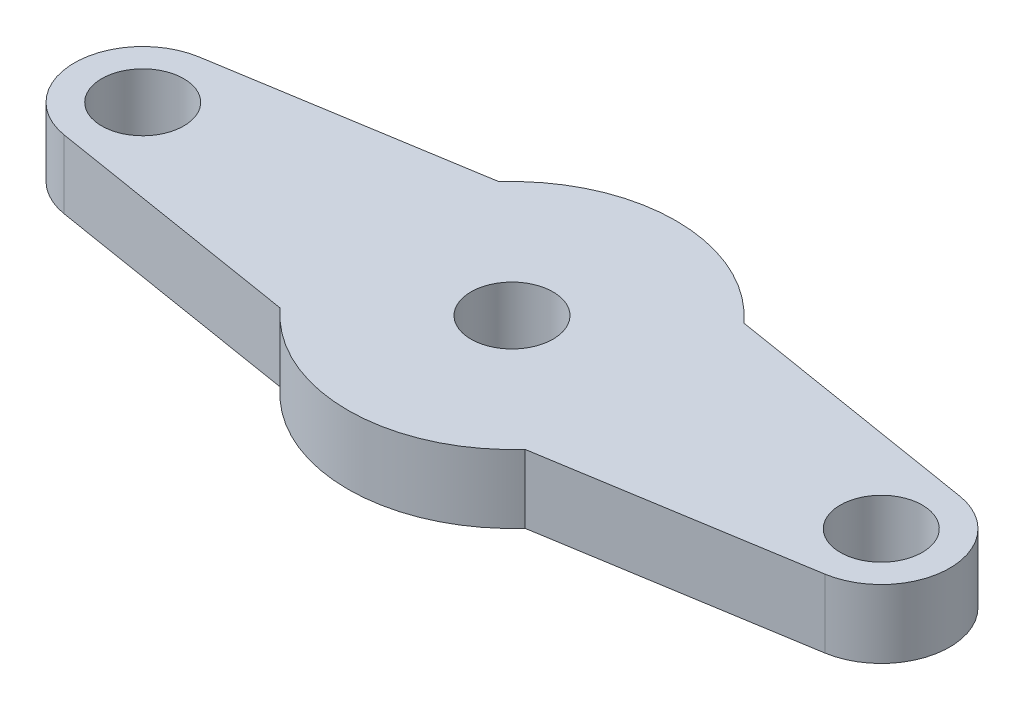
ISO-10303-21;
HEADER;
FILE_DESCRIPTION(('STEP AP214'),'2;1');
FILE_NAME('part.step','',(''),(''),'','','');
FILE_SCHEMA(('AUTOMOTIVE_DESIGN { 1 0 10303 214 1 1 1 1 }'));
ENDSEC;
DATA;
#1=APPLICATION_CONTEXT('core data for automotive mechanical design processes');
#2=APPLICATION_PROTOCOL_DEFINITION('international standard','automotive_design',2000,#1);
#3=PRODUCT_CONTEXT('',#1,'mechanical');
#4=PRODUCT('Part','Part','',(#3));
#5=PRODUCT_RELATED_PRODUCT_CATEGORY('part','',(#4));
#6=PRODUCT_DEFINITION_FORMATION('','',#4);
#7=PRODUCT_DEFINITION_CONTEXT('part definition',#1,'design');
#8=PRODUCT_DEFINITION('design','',#6,#7);
#9=PRODUCT_DEFINITION_SHAPE('','',#8);
#10=(LENGTH_UNIT() NAMED_UNIT(*) SI_UNIT(.MILLI.,.METRE.));
#11=(NAMED_UNIT(*) PLANE_ANGLE_UNIT() SI_UNIT($,.RADIAN.));
#12=(NAMED_UNIT(*) SI_UNIT($,.STERADIAN.) SOLID_ANGLE_UNIT());
#13=UNCERTAINTY_MEASURE_WITH_UNIT(LENGTH_MEASURE(1.E-05),#10,'distance_accuracy_value','');
#14=(GEOMETRIC_REPRESENTATION_CONTEXT(3) GLOBAL_UNCERTAINTY_ASSIGNED_CONTEXT((#13)) GLOBAL_UNIT_ASSIGNED_CONTEXT((#10,
#11,#12)) REPRESENTATION_CONTEXT('',''));
#15=CARTESIAN_POINT('',(0.,0.,0.));
#16=DIRECTION('',(0.,0.,1.));
#17=DIRECTION('',(1.,0.,0.));
#18=AXIS2_PLACEMENT_3D('',#15,#16,#17);
#19=CARTESIAN_POINT('',(0.,0.,0.));
#20=DIRECTION('',(0.,1.,0.));
#21=DIRECTION('',(1.,0.,0.));
#22=AXIS2_PLACEMENT_3D('',#19,#20,#21);
#23=PLANE('',#22);
#24=CARTESIAN_POINT('',(13.5,0.,0.));
#25=DIRECTION('',(0.,1.,0.));
#26=DIRECTION('',(0.,0.,1.));
#27=AXIS2_PLACEMENT_3D('',#24,#25,#26);
#28=CIRCLE('',#27,1.5);
#29=CARTESIAN_POINT('',(13.5,0.,-1.5));
#30=VERTEX_POINT('',#29);
#31=EDGE_CURVE('E185',#30,#30,#28,.T.);
#32=ORIENTED_EDGE('',*,*,#31,.T.);
#33=EDGE_LOOP('',(#32));
#34=FACE_BOUND('',#33,.T.);
#35=CARTESIAN_POINT('',(-13.5,0.,0.));
#36=DIRECTION('',(0.,1.,0.));
#37=DIRECTION('',(0.,0.,1.));
#38=AXIS2_PLACEMENT_3D('',#35,#36,#37);
#39=CIRCLE('',#38,1.5);
#40=CARTESIAN_POINT('',(-13.5,0.,-1.5));
#41=VERTEX_POINT('',#40);
#42=EDGE_CURVE('E141',#41,#41,#39,.T.);
#43=ORIENTED_EDGE('',*,*,#42,.T.);
#44=EDGE_LOOP('',(#43));
#45=FACE_BOUND('',#44,.T.);
#46=CARTESIAN_POINT('',(0.,0.,0.));
#47=DIRECTION('',(0.,1.,0.));
#48=DIRECTION('',(0.,0.,1.));
#49=AXIS2_PLACEMENT_3D('',#46,#47,#48);
#50=CIRCLE('',#49,1.5);
#51=CARTESIAN_POINT('',(0.,0.,1.5));
#52=VERTEX_POINT('',#51);
#53=EDGE_CURVE('E176',#52,#52,#50,.T.);
#54=ORIENTED_EDGE('',*,*,#53,.T.);
#55=EDGE_LOOP('',(#54));
#56=FACE_BOUND('',#55,.T.);
#57=DIRECTION('',(0.987049761955838,0.,-0.160414361647964));
#58=VECTOR('',#57,1.);
#59=CARTESIAN_POINT('',(-0.748428264329384,0.,-4.60517333085503));
#60=LINE('',#59,#58);
#61=CARTESIAN_POINT('',(-13.9010359041199,0.,-2.46762440488959));
#62=VERTEX_POINT('',#61);
#63=CARTESIAN_POINT('',(-4.47213595499958,0.,-4.));
#64=VERTEX_POINT('',#63);
#65=EDGE_CURVE('E74',#62,#64,#60,.T.);
#66=ORIENTED_EDGE('',*,*,#65,.T.);
#67=CARTESIAN_POINT('',(0.,0.,0.));
#68=DIRECTION('',(0.,1.,0.));
#69=DIRECTION('',(0.,0.,1.));
#70=AXIS2_PLACEMENT_3D('',#67,#68,#69);
#71=CIRCLE('',#70,6.);
#72=CARTESIAN_POINT('',(4.47213595499958,0.,-4.));
#73=VERTEX_POINT('',#72);
#74=EDGE_CURVE('E157',#73,#64,#71,.T.);
#75=ORIENTED_EDGE('',*,*,#74,.F.);
#76=DIRECTION('',(-0.987049761955838,0.,-0.160414361647964));
#77=VECTOR('',#76,1.);
#78=CARTESIAN_POINT('',(0.748428264329384,0.,-4.60517333085503));
#79=LINE('',#78,#77);
#80=CARTESIAN_POINT('',(13.9010359041199,0.,-2.4676244048896));
#81=VERTEX_POINT('',#80);
#82=EDGE_CURVE('E28',#81,#73,#79,.T.);
#83=ORIENTED_EDGE('',*,*,#82,.F.);
#84=CARTESIAN_POINT('',(13.5,0.,0.));
#85=DIRECTION('',(0.,1.,0.));
#86=DIRECTION('',(0.,0.,1.));
#87=AXIS2_PLACEMENT_3D('',#84,#85,#86);
#88=CIRCLE('',#87,2.5);
#89=CARTESIAN_POINT('',(13.9010359041199,0.,2.46762440488959));
#90=VERTEX_POINT('',#89);
#91=EDGE_CURVE('E166',#90,#81,#88,.T.);
#92=ORIENTED_EDGE('',*,*,#91,.F.);
#93=DIRECTION('',(-0.987049761955838,0.,0.160414361647964));
#94=VECTOR('',#93,1.);
#95=CARTESIAN_POINT('',(0.748428264329379,0.,4.60517333085502));
#96=LINE('',#95,#94);
#97=CARTESIAN_POINT('',(4.47213595499953,0.,4.));
#98=VERTEX_POINT('',#97);
#99=EDGE_CURVE('E172',#90,#98,#96,.T.);
#100=ORIENTED_EDGE('',*,*,#99,.T.);
#101=CARTESIAN_POINT('',(0.,0.,0.));
#102=DIRECTION('',(0.,1.,0.));
#103=DIRECTION('',(0.,0.,1.));
#104=AXIS2_PLACEMENT_3D('',#101,#102,#103);
#105=CIRCLE('',#104,6.);
#106=CARTESIAN_POINT('',(-4.47213595499954,0.,4.));
#107=VERTEX_POINT('',#106);
#108=EDGE_CURVE('E121',#107,#98,#105,.T.);
#109=ORIENTED_EDGE('',*,*,#108,.F.);
#110=DIRECTION('',(0.987049761955838,0.,0.160414361647964));
#111=VECTOR('',#110,1.);
#112=CARTESIAN_POINT('',(-0.74842826432938,0.,4.60517333085502));
#113=LINE('',#112,#111);
#114=CARTESIAN_POINT('',(-13.9010359041199,0.,2.46762440488959));
#115=VERTEX_POINT('',#114);
#116=EDGE_CURVE('E186',#115,#107,#113,.T.);
#117=ORIENTED_EDGE('',*,*,#116,.F.);
#118=CARTESIAN_POINT('',(-13.5,0.,0.));
#119=DIRECTION('',(0.,1.,0.));
#120=DIRECTION('',(0.,0.,1.));
#121=AXIS2_PLACEMENT_3D('',#118,#119,#120);
#122=CIRCLE('',#121,2.5);
#123=EDGE_CURVE('E214',#62,#115,#122,.T.);
#124=ORIENTED_EDGE('',*,*,#123,.F.);
#125=EDGE_LOOP('',(#66,#75,#83,#92,#100,#109,#117,#124));
#126=FACE_BOUND('',#125,.T.);
#127=ADVANCED_FACE('F17',(#34,#45,#56,#126),#23,.F.);
#128=CARTESIAN_POINT('',(0.,2.5,0.));
#129=DIRECTION('',(0.,1.,0.));
#130=DIRECTION('',(1.,0.,0.));
#131=AXIS2_PLACEMENT_3D('',#128,#129,#130);
#132=PLANE('',#131);
#133=CARTESIAN_POINT('',(13.5,2.5,0.));
#134=DIRECTION('',(0.,1.,0.));
#135=DIRECTION('',(0.,0.,1.));
#136=AXIS2_PLACEMENT_3D('',#133,#134,#135);
#137=CIRCLE('',#136,1.5);
#138=CARTESIAN_POINT('',(13.5,2.5,-1.5));
#139=VERTEX_POINT('',#138);
#140=EDGE_CURVE('E184',#139,#139,#137,.T.);
#141=ORIENTED_EDGE('',*,*,#140,.F.);
#142=EDGE_LOOP('',(#141));
#143=FACE_BOUND('',#142,.T.);
#144=CARTESIAN_POINT('',(-13.5,2.5,0.));
#145=DIRECTION('',(0.,1.,0.));
#146=DIRECTION('',(0.,0.,1.));
#147=AXIS2_PLACEMENT_3D('',#144,#145,#146);
#148=CIRCLE('',#147,1.5);
#149=CARTESIAN_POINT('',(-13.5,2.5,-1.5));
#150=VERTEX_POINT('',#149);
#151=EDGE_CURVE('E143',#150,#150,#148,.T.);
#152=ORIENTED_EDGE('',*,*,#151,.F.);
#153=EDGE_LOOP('',(#152));
#154=FACE_BOUND('',#153,.T.);
#155=CARTESIAN_POINT('',(0.,2.5,0.));
#156=DIRECTION('',(0.,1.,0.));
#157=DIRECTION('',(0.,0.,1.));
#158=AXIS2_PLACEMENT_3D('',#155,#156,#157);
#159=CIRCLE('',#158,1.5);
#160=CARTESIAN_POINT('',(0.,2.5,1.5));
#161=VERTEX_POINT('',#160);
#162=EDGE_CURVE('E234',#161,#161,#159,.T.);
#163=ORIENTED_EDGE('',*,*,#162,.F.);
#164=EDGE_LOOP('',(#163));
#165=FACE_BOUND('',#164,.T.);
#166=DIRECTION('',(0.987049761955838,0.,-0.160414361647964));
#167=VECTOR('',#166,1.);
#168=CARTESIAN_POINT('',(-0.748428264329384,2.5,-4.60517333085503));
#169=LINE('',#168,#167);
#170=CARTESIAN_POINT('',(-13.9010359041199,2.5,-2.46762440488959));
#171=VERTEX_POINT('',#170);
#172=CARTESIAN_POINT('',(-4.47213595499958,2.5,-4.));
#173=VERTEX_POINT('',#172);
#174=EDGE_CURVE('E171',#171,#173,#169,.T.);
#175=ORIENTED_EDGE('',*,*,#174,.F.);
#176=CARTESIAN_POINT('',(-13.5,2.5,0.));
#177=DIRECTION('',(0.,1.,0.));
#178=DIRECTION('',(0.,0.,1.));
#179=AXIS2_PLACEMENT_3D('',#176,#177,#178);
#180=CIRCLE('',#179,2.5);
#181=CARTESIAN_POINT('',(-13.9010359041199,2.5,2.46762440488959));
#182=VERTEX_POINT('',#181);
#183=EDGE_CURVE('E190',#171,#182,#180,.T.);
#184=ORIENTED_EDGE('',*,*,#183,.T.);
#185=DIRECTION('',(0.987049761955838,0.,0.160414361647964));
#186=VECTOR('',#185,1.);
#187=CARTESIAN_POINT('',(-0.74842826432938,2.5,4.60517333085502));
#188=LINE('',#187,#186);
#189=CARTESIAN_POINT('',(-4.47213595499954,2.5,4.));
#190=VERTEX_POINT('',#189);
#191=EDGE_CURVE('E211',#182,#190,#188,.T.);
#192=ORIENTED_EDGE('',*,*,#191,.T.);
#193=CARTESIAN_POINT('',(0.,2.5,0.));
#194=DIRECTION('',(0.,1.,0.));
#195=DIRECTION('',(0.,0.,1.));
#196=AXIS2_PLACEMENT_3D('',#193,#194,#195);
#197=CIRCLE('',#196,6.);
#198=CARTESIAN_POINT('',(4.47213595499953,2.5,4.));
#199=VERTEX_POINT('',#198);
#200=EDGE_CURVE('E108',#190,#199,#197,.T.);
#201=ORIENTED_EDGE('',*,*,#200,.T.);
#202=DIRECTION('',(-0.987049761955838,0.,0.160414361647964));
#203=VECTOR('',#202,1.);
#204=CARTESIAN_POINT('',(0.748428264329379,2.5,4.60517333085502));
#205=LINE('',#204,#203);
#206=CARTESIAN_POINT('',(13.9010359041199,2.5,2.46762440488959));
#207=VERTEX_POINT('',#206);
#208=EDGE_CURVE('E207',#207,#199,#205,.T.);
#209=ORIENTED_EDGE('',*,*,#208,.F.);
#210=CARTESIAN_POINT('',(13.5,2.5,0.));
#211=DIRECTION('',(0.,1.,0.));
#212=DIRECTION('',(0.,0.,1.));
#213=AXIS2_PLACEMENT_3D('',#210,#211,#212);
#214=CIRCLE('',#213,2.5);
#215=CARTESIAN_POINT('',(13.9010359041199,2.5,-2.4676244048896));
#216=VERTEX_POINT('',#215);
#217=EDGE_CURVE('E155',#207,#216,#214,.T.);
#218=ORIENTED_EDGE('',*,*,#217,.T.);
#219=DIRECTION('',(-0.987049761955838,0.,-0.160414361647964));
#220=VECTOR('',#219,1.);
#221=CARTESIAN_POINT('',(0.748428264329384,2.5,-4.60517333085503));
#222=LINE('',#221,#220);
#223=CARTESIAN_POINT('',(4.47213595499958,2.5,-4.));
#224=VERTEX_POINT('',#223);
#225=EDGE_CURVE('E11',#216,#224,#222,.T.);
#226=ORIENTED_EDGE('',*,*,#225,.T.);
#227=CARTESIAN_POINT('',(0.,2.5,0.));
#228=DIRECTION('',(0.,1.,0.));
#229=DIRECTION('',(0.,0.,1.));
#230=AXIS2_PLACEMENT_3D('',#227,#228,#229);
#231=CIRCLE('',#230,6.);
#232=EDGE_CURVE('E21',#224,#173,#231,.T.);
#233=ORIENTED_EDGE('',*,*,#232,.T.);
#234=EDGE_LOOP('',(#175,#184,#192,#201,#209,#218,#226,#233));
#235=FACE_BOUND('',#234,.T.);
#236=ADVANCED_FACE('F270',(#143,#154,#165,#235),#132,.T.);
#237=CARTESIAN_POINT('',(0.748428264329384,2.5,-4.60517333085503));
#238=DIRECTION('',(-0.160414361647964,0.,0.987049761955838));
#239=DIRECTION('',(0.,1.,0.));
#240=AXIS2_PLACEMENT_3D('',#237,#238,#239);
#241=PLANE('',#240);
#242=ORIENTED_EDGE('',*,*,#82,.T.);
#243=DIRECTION('',(0.,-1.,0.));
#244=VECTOR('',#243,1.);
#245=CARTESIAN_POINT('',(4.47213595499958,2.5,-4.));
#246=LINE('',#245,#244);
#247=EDGE_CURVE('E162',#224,#73,#246,.T.);
#248=ORIENTED_EDGE('',*,*,#247,.F.);
#249=ORIENTED_EDGE('',*,*,#225,.F.);
#250=DIRECTION('',(0.,-1.,0.));
#251=VECTOR('',#250,1.);
#252=CARTESIAN_POINT('',(13.9010359041199,2.5,-2.4676244048896));
#253=LINE('',#252,#251);
#254=EDGE_CURVE('E163',#216,#81,#253,.T.);
#255=ORIENTED_EDGE('',*,*,#254,.T.);
#256=EDGE_LOOP('',(#242,#248,#249,#255));
#257=FACE_BOUND('',#256,.T.);
#258=ADVANCED_FACE('F276',(#257),#241,.F.);
#259=CARTESIAN_POINT('',(13.5,2.5,0.));
#260=DIRECTION('',(0.,-1.,0.));
#261=DIRECTION('',(0.,0.,-1.));
#262=AXIS2_PLACEMENT_3D('',#259,#260,#261);
#263=CYLINDRICAL_SURFACE('',#262,2.5);
#264=ORIENTED_EDGE('',*,*,#91,.T.);
#265=ORIENTED_EDGE('',*,*,#254,.F.);
#266=ORIENTED_EDGE('',*,*,#217,.F.);
#267=DIRECTION('',(0.,-1.,0.));
#268=VECTOR('',#267,1.);
#269=CARTESIAN_POINT('',(13.9010359041199,2.5,2.46762440488959));
#270=LINE('',#269,#268);
#271=EDGE_CURVE('E175',#207,#90,#270,.T.);
#272=ORIENTED_EDGE('',*,*,#271,.T.);
#273=EDGE_LOOP('',(#264,#265,#266,#272));
#274=FACE_BOUND('',#273,.T.);
#275=ADVANCED_FACE('F294',(#274),#263,.T.);
#276=CARTESIAN_POINT('',(0.748428264329379,2.5,4.60517333085502));
#277=DIRECTION('',(0.160414361647964,0.,0.987049761955838));
#278=DIRECTION('',(0.,-1.,0.));
#279=AXIS2_PLACEMENT_3D('',#276,#277,#278);
#280=PLANE('',#279);
#281=ORIENTED_EDGE('',*,*,#99,.F.);
#282=ORIENTED_EDGE('',*,*,#271,.F.);
#283=ORIENTED_EDGE('',*,*,#208,.T.);
#284=DIRECTION('',(0.,-1.,0.));
#285=VECTOR('',#284,1.);
#286=CARTESIAN_POINT('',(4.47213595499953,2.5,4.));
#287=LINE('',#286,#285);
#288=EDGE_CURVE('E210',#199,#98,#287,.T.);
#289=ORIENTED_EDGE('',*,*,#288,.T.);
#290=EDGE_LOOP('',(#281,#282,#283,#289));
#291=FACE_BOUND('',#290,.T.);
#292=ADVANCED_FACE('F290',(#291),#280,.T.);
#293=CARTESIAN_POINT('',(0.,2.5,0.));
#294=DIRECTION('',(0.,-1.,0.));
#295=DIRECTION('',(0.,0.,1.));
#296=AXIS2_PLACEMENT_3D('',#293,#294,#295);
#297=CYLINDRICAL_SURFACE('',#296,6.);
#298=ORIENTED_EDGE('',*,*,#108,.T.);
#299=ORIENTED_EDGE('',*,*,#288,.F.);
#300=ORIENTED_EDGE('',*,*,#200,.F.);
#301=DIRECTION('',(0.,-1.,0.));
#302=VECTOR('',#301,1.);
#303=CARTESIAN_POINT('',(-4.47213595499954,2.5,4.));
#304=LINE('',#303,#302);
#305=EDGE_CURVE('E189',#190,#107,#304,.T.);
#306=ORIENTED_EDGE('',*,*,#305,.T.);
#307=EDGE_LOOP('',(#298,#299,#300,#306));
#308=FACE_BOUND('',#307,.T.);
#309=ADVANCED_FACE('F287',(#308),#297,.T.);
#310=CARTESIAN_POINT('',(-0.74842826432938,2.5,4.60517333085502));
#311=DIRECTION('',(0.160414361647964,0.,-0.987049761955838));
#312=DIRECTION('',(0.,-1.,0.));
#313=AXIS2_PLACEMENT_3D('',#310,#311,#312);
#314=PLANE('',#313);
#315=ORIENTED_EDGE('',*,*,#116,.T.);
#316=ORIENTED_EDGE('',*,*,#305,.F.);
#317=ORIENTED_EDGE('',*,*,#191,.F.);
#318=DIRECTION('',(0.,-1.,0.));
#319=VECTOR('',#318,1.);
#320=CARTESIAN_POINT('',(-13.9010359041199,2.5,2.46762440488959));
#321=LINE('',#320,#319);
#322=EDGE_CURVE('E217',#182,#115,#321,.T.);
#323=ORIENTED_EDGE('',*,*,#322,.T.);
#324=EDGE_LOOP('',(#315,#316,#317,#323));
#325=FACE_BOUND('',#324,.T.);
#326=ADVANCED_FACE('F19',(#325),#314,.F.);
#327=CARTESIAN_POINT('',(-13.5,2.5,0.));
#328=DIRECTION('',(0.,-1.,0.));
#329=DIRECTION('',(0.,0.,-1.));
#330=AXIS2_PLACEMENT_3D('',#327,#328,#329);
#331=CYLINDRICAL_SURFACE('',#330,2.5);
#332=ORIENTED_EDGE('',*,*,#123,.T.);
#333=ORIENTED_EDGE('',*,*,#322,.F.);
#334=ORIENTED_EDGE('',*,*,#183,.F.);
#335=DIRECTION('',(0.,-1.,0.));
#336=VECTOR('',#335,1.);
#337=CARTESIAN_POINT('',(-13.9010359041199,2.5,-2.46762440488959));
#338=LINE('',#337,#336);
#339=EDGE_CURVE('E167',#171,#62,#338,.T.);
#340=ORIENTED_EDGE('',*,*,#339,.T.);
#341=EDGE_LOOP('',(#332,#333,#334,#340));
#342=FACE_BOUND('',#341,.T.);
#343=ADVANCED_FACE('F267',(#342),#331,.T.);
#344=CARTESIAN_POINT('',(-0.748428264329384,2.5,-4.60517333085503));
#345=DIRECTION('',(-0.160414361647964,0.,-0.987049761955838));
#346=DIRECTION('',(-0.987049761955838,0.,0.160414361647964));
#347=AXIS2_PLACEMENT_3D('',#344,#345,#346);
#348=PLANE('',#347);
#349=ORIENTED_EDGE('',*,*,#65,.F.);
#350=ORIENTED_EDGE('',*,*,#339,.F.);
#351=ORIENTED_EDGE('',*,*,#174,.T.);
#352=DIRECTION('',(0.,-1.,0.));
#353=VECTOR('',#352,1.);
#354=CARTESIAN_POINT('',(-4.47213595499958,2.5,-4.));
#355=LINE('',#354,#353);
#356=EDGE_CURVE('E161',#173,#64,#355,.T.);
#357=ORIENTED_EDGE('',*,*,#356,.T.);
#358=EDGE_LOOP('',(#349,#350,#351,#357));
#359=FACE_BOUND('',#358,.T.);
#360=ADVANCED_FACE('F283',(#359),#348,.T.);
#361=CARTESIAN_POINT('',(0.,2.5,0.));
#362=DIRECTION('',(0.,-1.,0.));
#363=DIRECTION('',(0.,0.,-1.));
#364=AXIS2_PLACEMENT_3D('',#361,#362,#363);
#365=CYLINDRICAL_SURFACE('',#364,6.);
#366=ORIENTED_EDGE('',*,*,#232,.F.);
#367=ORIENTED_EDGE('',*,*,#247,.T.);
#368=ORIENTED_EDGE('',*,*,#74,.T.);
#369=ORIENTED_EDGE('',*,*,#356,.F.);
#370=EDGE_LOOP('',(#366,#367,#368,#369));
#371=FACE_BOUND('',#370,.T.);
#372=ADVANCED_FACE('F281',(#371),#365,.T.);
#373=CARTESIAN_POINT('',(0.,2.5,0.));
#374=DIRECTION('',(0.,-1.,0.));
#375=DIRECTION('',(0.,0.,-1.));
#376=AXIS2_PLACEMENT_3D('',#373,#374,#375);
#377=CYLINDRICAL_SURFACE('',#376,1.5);
#378=ORIENTED_EDGE('',*,*,#162,.T.);
#379=DIRECTION('',(0.,-1.,0.));
#380=VECTOR('',#379,1.);
#381=CARTESIAN_POINT('',(0.,2.5,1.5));
#382=LINE('',#381,#380);
#383=EDGE_CURVE('E179',#161,#52,#382,.T.);
#384=ORIENTED_EDGE('',*,*,#383,.T.);
#385=ORIENTED_EDGE('',*,*,#53,.F.);
#386=ORIENTED_EDGE('',*,*,#383,.F.);
#387=EDGE_LOOP('',(#378,#384,#385,#386));
#388=FACE_BOUND('',#387,.T.);
#389=ADVANCED_FACE('F303',(#388),#377,.F.);
#390=CARTESIAN_POINT('',(13.5,0.,0.));
#391=DIRECTION('',(0.,1.,0.));
#392=DIRECTION('',(0.,0.,1.));
#393=AXIS2_PLACEMENT_3D('',#390,#391,#392);
#394=CYLINDRICAL_SURFACE('',#393,1.5);
#395=ORIENTED_EDGE('',*,*,#31,.F.);
#396=DIRECTION('',(0.,1.,0.));
#397=VECTOR('',#396,1.);
#398=CARTESIAN_POINT('',(13.5,0.,-1.5));
#399=LINE('',#398,#397);
#400=EDGE_CURVE('E180',#30,#139,#399,.T.);
#401=ORIENTED_EDGE('',*,*,#400,.T.);
#402=ORIENTED_EDGE('',*,*,#140,.T.);
#403=ORIENTED_EDGE('',*,*,#400,.F.);
#404=EDGE_LOOP('',(#395,#401,#402,#403));
#405=FACE_BOUND('',#404,.T.);
#406=ADVANCED_FACE('F299',(#405),#394,.F.);
#407=CARTESIAN_POINT('',(-13.5,0.,0.));
#408=DIRECTION('',(0.,1.,0.));
#409=DIRECTION('',(0.,0.,1.));
#410=AXIS2_PLACEMENT_3D('',#407,#408,#409);
#411=CYLINDRICAL_SURFACE('',#410,1.5);
#412=ORIENTED_EDGE('',*,*,#42,.F.);
#413=DIRECTION('',(0.,1.,0.));
#414=VECTOR('',#413,1.);
#415=CARTESIAN_POINT('',(-13.5,0.,-1.5));
#416=LINE('',#415,#414);
#417=EDGE_CURVE('E138',#41,#150,#416,.T.);
#418=ORIENTED_EDGE('',*,*,#417,.T.);
#419=ORIENTED_EDGE('',*,*,#151,.T.);
#420=ORIENTED_EDGE('',*,*,#417,.F.);
#421=EDGE_LOOP('',(#412,#418,#419,#420));
#422=FACE_BOUND('',#421,.T.);
#423=ADVANCED_FACE('F140',(#422),#411,.F.);
#424=CLOSED_SHELL('',(#127,#236,#258,#275,#292,#309,#326,#343,#360,#372,#389,#406,#423));
#425=MANIFOLD_SOLID_BREP('B1',#424);
#426=ADVANCED_BREP_SHAPE_REPRESENTATION('',(#18,#425),#14);
#427=SHAPE_DEFINITION_REPRESENTATION(#9,#426);
ENDSEC;
END-ISO-10303-21;
